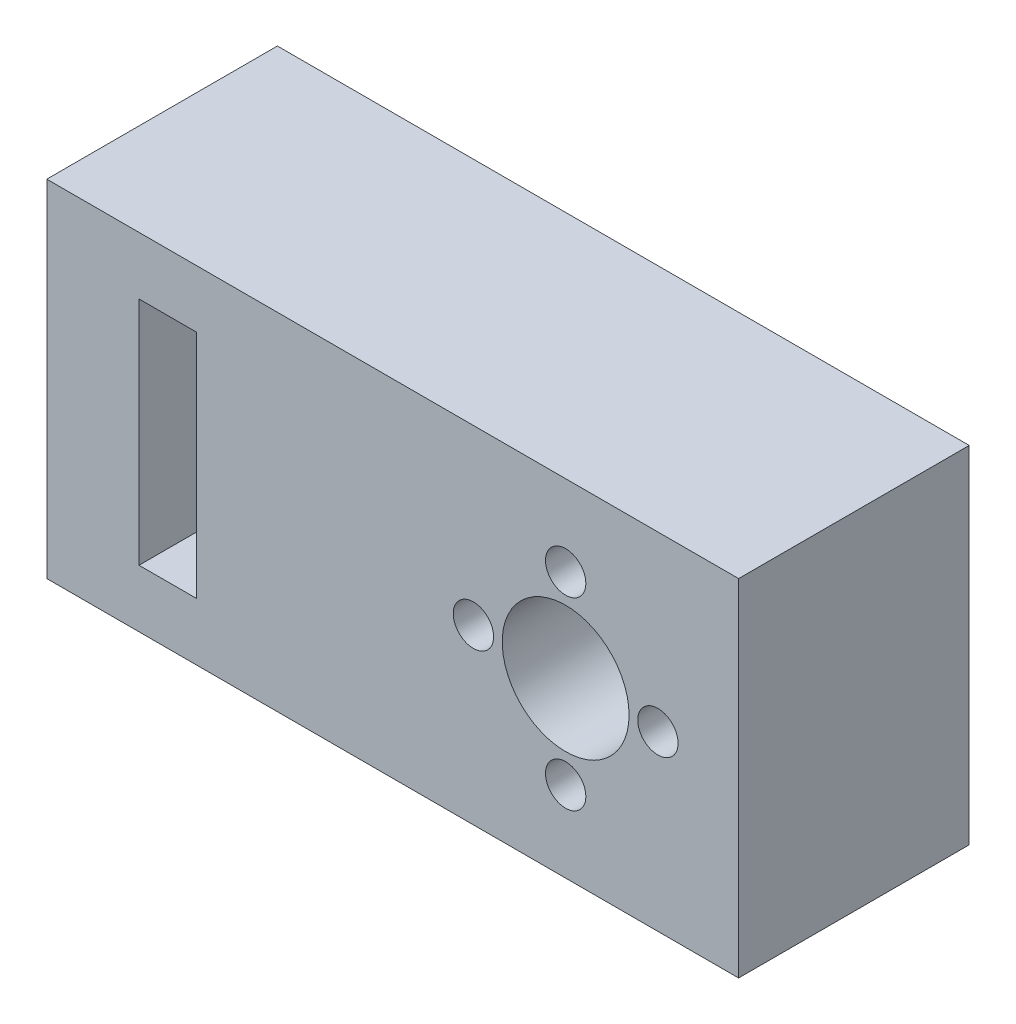
ISO-10303-21;
HEADER;
FILE_DESCRIPTION(('STEP AP214'),'2;1');
FILE_NAME('part.step','',(''),(''),'','','');
FILE_SCHEMA(('AUTOMOTIVE_DESIGN { 1 0 10303 214 1 1 1 1 }'));
ENDSEC;
DATA;
#1=APPLICATION_CONTEXT('core data for automotive mechanical design processes');
#2=APPLICATION_PROTOCOL_DEFINITION('international standard','automotive_design',2000,#1);
#3=PRODUCT_CONTEXT('',#1,'mechanical');
#4=PRODUCT('Part','Part','',(#3));
#5=PRODUCT_RELATED_PRODUCT_CATEGORY('part','',(#4));
#6=PRODUCT_DEFINITION_FORMATION('','',#4);
#7=PRODUCT_DEFINITION_CONTEXT('part definition',#1,'design');
#8=PRODUCT_DEFINITION('design','',#6,#7);
#9=PRODUCT_DEFINITION_SHAPE('','',#8);
#10=(LENGTH_UNIT() NAMED_UNIT(*) SI_UNIT(.MILLI.,.METRE.));
#11=(NAMED_UNIT(*) PLANE_ANGLE_UNIT() SI_UNIT($,.RADIAN.));
#12=(NAMED_UNIT(*) SI_UNIT($,.STERADIAN.) SOLID_ANGLE_UNIT());
#13=UNCERTAINTY_MEASURE_WITH_UNIT(LENGTH_MEASURE(1.E-05),#10,'distance_accuracy_value','');
#14=(GEOMETRIC_REPRESENTATION_CONTEXT(3) GLOBAL_UNCERTAINTY_ASSIGNED_CONTEXT((#13)) GLOBAL_UNIT_ASSIGNED_CONTEXT((#10,
#11,#12)) REPRESENTATION_CONTEXT('',''));
#15=CARTESIAN_POINT('',(0.,0.,0.));
#16=DIRECTION('',(0.,0.,1.));
#17=DIRECTION('',(1.,0.,0.));
#18=AXIS2_PLACEMENT_3D('',#15,#16,#17);
#19=CARTESIAN_POINT('',(0.,0.,10.));
#20=DIRECTION('',(0.,0.,1.));
#21=DIRECTION('',(1.,0.,0.));
#22=AXIS2_PLACEMENT_3D('',#19,#20,#21);
#23=PLANE('',#22);
#24=CARTESIAN_POINT('',(15.0000000000002,-8.,10.));
#25=DIRECTION('',(0.,0.,1.));
#26=DIRECTION('',(1.,0.,0.));
#27=AXIS2_PLACEMENT_3D('',#24,#25,#26);
#28=CIRCLE('',#27,1.75);
#29=CARTESIAN_POINT('',(16.7500000000002,-8.,10.));
#30=VERTEX_POINT('',#29);
#31=EDGE_CURVE('E272',#30,#30,#28,.T.);
#32=ORIENTED_EDGE('',*,*,#31,.F.);
#33=EDGE_LOOP('',(#32));
#34=FACE_BOUND('',#33,.T.);
#35=CARTESIAN_POINT('',(15.,8.,10.));
#36=DIRECTION('',(0.,0.,1.));
#37=DIRECTION('',(1.,0.,0.));
#38=AXIS2_PLACEMENT_3D('',#35,#36,#37);
#39=CIRCLE('',#38,1.75);
#40=CARTESIAN_POINT('',(16.75,8.,10.));
#41=VERTEX_POINT('',#40);
#42=EDGE_CURVE('E127',#41,#41,#39,.T.);
#43=ORIENTED_EDGE('',*,*,#42,.F.);
#44=EDGE_LOOP('',(#43));
#45=FACE_BOUND('',#44,.T.);
#46=CARTESIAN_POINT('',(15.,0.,10.));
#47=DIRECTION('',(0.,0.,1.));
#48=DIRECTION('',(1.,0.,0.));
#49=AXIS2_PLACEMENT_3D('',#46,#47,#48);
#50=CIRCLE('',#49,5.5);
#51=CARTESIAN_POINT('',(20.5,0.,10.));
#52=VERTEX_POINT('',#51);
#53=EDGE_CURVE('E137',#52,#52,#50,.T.);
#54=ORIENTED_EDGE('',*,*,#53,.F.);
#55=EDGE_LOOP('',(#54));
#56=FACE_BOUND('',#55,.T.);
#57=DIRECTION('',(0.,1.,0.));
#58=VECTOR('',#57,1.);
#59=CARTESIAN_POINT('',(30.,15.,10.));
#60=LINE('',#59,#58);
#61=CARTESIAN_POINT('',(30.,-15.,10.));
#62=VERTEX_POINT('',#61);
#63=CARTESIAN_POINT('',(30.,15.,10.));
#64=VERTEX_POINT('',#63);
#65=EDGE_CURVE('E143',#62,#64,#60,.T.);
#66=ORIENTED_EDGE('',*,*,#65,.T.);
#67=DIRECTION('',(-1.,0.,0.));
#68=VECTOR('',#67,1.);
#69=CARTESIAN_POINT('',(-30.,15.,10.));
#70=LINE('',#69,#68);
#71=CARTESIAN_POINT('',(-30.,15.,10.));
#72=VERTEX_POINT('',#71);
#73=EDGE_CURVE('E146',#64,#72,#70,.T.);
#74=ORIENTED_EDGE('',*,*,#73,.T.);
#75=DIRECTION('',(0.,-1.,0.));
#76=VECTOR('',#75,1.);
#77=CARTESIAN_POINT('',(-30.,15.,10.));
#78=LINE('',#77,#76);
#79=CARTESIAN_POINT('',(-30.,-15.,10.));
#80=VERTEX_POINT('',#79);
#81=EDGE_CURVE('E149',#72,#80,#78,.T.);
#82=ORIENTED_EDGE('',*,*,#81,.T.);
#83=DIRECTION('',(1.,0.,0.));
#84=VECTOR('',#83,1.);
#85=CARTESIAN_POINT('',(-30.,-15.,10.));
#86=LINE('',#85,#84);
#87=EDGE_CURVE('E151',#80,#62,#86,.T.);
#88=ORIENTED_EDGE('',*,*,#87,.T.);
#89=EDGE_LOOP('',(#66,#74,#82,#88));
#90=FACE_BOUND('',#89,.T.);
#91=DIRECTION('',(1.,0.,0.));
#92=VECTOR('',#91,1.);
#93=CARTESIAN_POINT('',(-22.,-9.99999999999999,10.));
#94=LINE('',#93,#92);
#95=CARTESIAN_POINT('',(-22.,-9.99999999999999,10.));
#96=VERTEX_POINT('',#95);
#97=CARTESIAN_POINT('',(-17.,-9.99999999999999,10.));
#98=VERTEX_POINT('',#97);
#99=EDGE_CURVE('E106',#96,#98,#94,.T.);
#100=ORIENTED_EDGE('',*,*,#99,.F.);
#101=DIRECTION('',(0.,-1.,0.));
#102=VECTOR('',#101,1.);
#103=CARTESIAN_POINT('',(-22.,10.,10.));
#104=LINE('',#103,#102);
#105=CARTESIAN_POINT('',(-22.,10.,10.));
#106=VERTEX_POINT('',#105);
#107=EDGE_CURVE('E98',#106,#96,#104,.T.);
#108=ORIENTED_EDGE('',*,*,#107,.F.);
#109=DIRECTION('',(-1.,0.,0.));
#110=VECTOR('',#109,1.);
#111=CARTESIAN_POINT('',(-22.,10.,10.));
#112=LINE('',#111,#110);
#113=CARTESIAN_POINT('',(-17.,10.,10.));
#114=VERTEX_POINT('',#113);
#115=EDGE_CURVE('E121',#114,#106,#112,.T.);
#116=ORIENTED_EDGE('',*,*,#115,.F.);
#117=DIRECTION('',(0.,1.,0.));
#118=VECTOR('',#117,1.);
#119=CARTESIAN_POINT('',(-17.,10.,10.));
#120=LINE('',#119,#118);
#121=EDGE_CURVE('E119',#98,#114,#120,.T.);
#122=ORIENTED_EDGE('',*,*,#121,.F.);
#123=EDGE_LOOP('',(#100,#108,#116,#122));
#124=FACE_BOUND('',#123,.T.);
#125=CARTESIAN_POINT('',(23.0000000000001,0.,10.));
#126=DIRECTION('',(0.,0.,1.));
#127=DIRECTION('',(1.,0.,0.));
#128=AXIS2_PLACEMENT_3D('',#125,#126,#127);
#129=CIRCLE('',#128,1.75);
#130=CARTESIAN_POINT('',(24.7500000000001,0.,10.));
#131=VERTEX_POINT('',#130);
#132=EDGE_CURVE('E278',#131,#131,#129,.T.);
#133=ORIENTED_EDGE('',*,*,#132,.F.);
#134=EDGE_LOOP('',(#133));
#135=FACE_BOUND('',#134,.T.);
#136=CARTESIAN_POINT('',(7.00000000000012,0.,10.));
#137=DIRECTION('',(0.,0.,1.));
#138=DIRECTION('',(1.,0.,0.));
#139=AXIS2_PLACEMENT_3D('',#136,#137,#138);
#140=CIRCLE('',#139,1.75);
#141=CARTESIAN_POINT('',(8.75000000000012,0.,10.));
#142=VERTEX_POINT('',#141);
#143=EDGE_CURVE('E265',#142,#142,#140,.T.);
#144=ORIENTED_EDGE('',*,*,#143,.F.);
#145=EDGE_LOOP('',(#144));
#146=FACE_BOUND('',#145,.T.);
#147=ADVANCED_FACE('F33',(#34,#45,#56,#90,#124,#135,#146),#23,.T.);
#148=CARTESIAN_POINT('',(0.,0.,-10.));
#149=DIRECTION('',(0.,0.,1.));
#150=DIRECTION('',(1.,0.,0.));
#151=AXIS2_PLACEMENT_3D('',#148,#149,#150);
#152=PLANE('',#151);
#153=CARTESIAN_POINT('',(15.0000000000002,-8.,-10.));
#154=DIRECTION('',(0.,0.,1.));
#155=DIRECTION('',(1.,0.,0.));
#156=AXIS2_PLACEMENT_3D('',#153,#154,#155);
#157=CIRCLE('',#156,1.75);
#158=CARTESIAN_POINT('',(16.7500000000002,-8.,-10.));
#159=VERTEX_POINT('',#158);
#160=EDGE_CURVE('E270',#159,#159,#157,.T.);
#161=ORIENTED_EDGE('',*,*,#160,.T.);
#162=EDGE_LOOP('',(#161));
#163=FACE_BOUND('',#162,.T.);
#164=CARTESIAN_POINT('',(15.,8.,-10.));
#165=DIRECTION('',(0.,0.,1.));
#166=DIRECTION('',(1.,0.,0.));
#167=AXIS2_PLACEMENT_3D('',#164,#165,#166);
#168=CIRCLE('',#167,1.75);
#169=CARTESIAN_POINT('',(16.75,8.,-10.));
#170=VERTEX_POINT('',#169);
#171=EDGE_CURVE('E281',#170,#170,#168,.T.);
#172=ORIENTED_EDGE('',*,*,#171,.T.);
#173=EDGE_LOOP('',(#172));
#174=FACE_BOUND('',#173,.T.);
#175=CARTESIAN_POINT('',(15.,0.,-10.));
#176=DIRECTION('',(0.,0.,1.));
#177=DIRECTION('',(1.,0.,0.));
#178=AXIS2_PLACEMENT_3D('',#175,#176,#177);
#179=CIRCLE('',#178,5.5);
#180=CARTESIAN_POINT('',(20.5,0.,-10.));
#181=VERTEX_POINT('',#180);
#182=EDGE_CURVE('E114',#181,#181,#179,.T.);
#183=ORIENTED_EDGE('',*,*,#182,.T.);
#184=EDGE_LOOP('',(#183));
#185=FACE_BOUND('',#184,.T.);
#186=DIRECTION('',(0.,1.,0.));
#187=VECTOR('',#186,1.);
#188=CARTESIAN_POINT('',(30.,15.,-10.));
#189=LINE('',#188,#187);
#190=CARTESIAN_POINT('',(30.,-15.,-10.));
#191=VERTEX_POINT('',#190);
#192=CARTESIAN_POINT('',(30.,15.,-10.));
#193=VERTEX_POINT('',#192);
#194=EDGE_CURVE('E140',#191,#193,#189,.T.);
#195=ORIENTED_EDGE('',*,*,#194,.F.);
#196=DIRECTION('',(1.,0.,0.));
#197=VECTOR('',#196,1.);
#198=CARTESIAN_POINT('',(-30.,-15.,-10.));
#199=LINE('',#198,#197);
#200=CARTESIAN_POINT('',(-30.,-15.,-10.));
#201=VERTEX_POINT('',#200);
#202=EDGE_CURVE('E147',#201,#191,#199,.T.);
#203=ORIENTED_EDGE('',*,*,#202,.F.);
#204=DIRECTION('',(0.,-1.,0.));
#205=VECTOR('',#204,1.);
#206=CARTESIAN_POINT('',(-30.,15.,-10.));
#207=LINE('',#206,#205);
#208=CARTESIAN_POINT('',(-30.,15.,-10.));
#209=VERTEX_POINT('',#208);
#210=EDGE_CURVE('E158',#209,#201,#207,.T.);
#211=ORIENTED_EDGE('',*,*,#210,.F.);
#212=DIRECTION('',(-1.,0.,0.));
#213=VECTOR('',#212,1.);
#214=CARTESIAN_POINT('',(-30.,15.,-10.));
#215=LINE('',#214,#213);
#216=EDGE_CURVE('E156',#193,#209,#215,.T.);
#217=ORIENTED_EDGE('',*,*,#216,.F.);
#218=EDGE_LOOP('',(#195,#203,#211,#217));
#219=FACE_BOUND('',#218,.T.);
#220=DIRECTION('',(0.,-1.,0.));
#221=VECTOR('',#220,1.);
#222=CARTESIAN_POINT('',(-22.,10.,-10.));
#223=LINE('',#222,#221);
#224=CARTESIAN_POINT('',(-22.,10.,-10.));
#225=VERTEX_POINT('',#224);
#226=CARTESIAN_POINT('',(-22.,-9.99999999999999,-10.));
#227=VERTEX_POINT('',#226);
#228=EDGE_CURVE('E56',#225,#227,#223,.T.);
#229=ORIENTED_EDGE('',*,*,#228,.T.);
#230=DIRECTION('',(1.,0.,0.));
#231=VECTOR('',#230,1.);
#232=CARTESIAN_POINT('',(-22.,-9.99999999999999,-10.));
#233=LINE('',#232,#231);
#234=CARTESIAN_POINT('',(-17.,-9.99999999999999,-10.));
#235=VERTEX_POINT('',#234);
#236=EDGE_CURVE('E113',#227,#235,#233,.T.);
#237=ORIENTED_EDGE('',*,*,#236,.T.);
#238=DIRECTION('',(0.,1.,0.));
#239=VECTOR('',#238,1.);
#240=CARTESIAN_POINT('',(-17.,10.,-10.));
#241=LINE('',#240,#239);
#242=CARTESIAN_POINT('',(-17.,10.,-10.));
#243=VERTEX_POINT('',#242);
#244=EDGE_CURVE('E129',#235,#243,#241,.T.);
#245=ORIENTED_EDGE('',*,*,#244,.T.);
#246=DIRECTION('',(-1.,0.,0.));
#247=VECTOR('',#246,1.);
#248=CARTESIAN_POINT('',(-22.,10.,-10.));
#249=LINE('',#248,#247);
#250=EDGE_CURVE('E107',#243,#225,#249,.T.);
#251=ORIENTED_EDGE('',*,*,#250,.T.);
#252=EDGE_LOOP('',(#229,#237,#245,#251));
#253=FACE_BOUND('',#252,.T.);
#254=CARTESIAN_POINT('',(23.0000000000001,0.,-10.));
#255=DIRECTION('',(0.,0.,1.));
#256=DIRECTION('',(1.,0.,0.));
#257=AXIS2_PLACEMENT_3D('',#254,#255,#256);
#258=CIRCLE('',#257,1.75);
#259=CARTESIAN_POINT('',(24.7500000000001,0.,-10.));
#260=VERTEX_POINT('',#259);
#261=EDGE_CURVE('E275',#260,#260,#258,.T.);
#262=ORIENTED_EDGE('',*,*,#261,.T.);
#263=EDGE_LOOP('',(#262));
#264=FACE_BOUND('',#263,.T.);
#265=CARTESIAN_POINT('',(7.00000000000012,0.,-10.));
#266=DIRECTION('',(0.,0.,1.));
#267=DIRECTION('',(1.,0.,0.));
#268=AXIS2_PLACEMENT_3D('',#265,#266,#267);
#269=CIRCLE('',#268,1.75);
#270=CARTESIAN_POINT('',(8.75000000000012,0.,-10.));
#271=VERTEX_POINT('',#270);
#272=EDGE_CURVE('E262',#271,#271,#269,.T.);
#273=ORIENTED_EDGE('',*,*,#272,.T.);
#274=EDGE_LOOP('',(#273));
#275=FACE_BOUND('',#274,.T.);
#276=ADVANCED_FACE('F176',(#163,#174,#185,#219,#253,#264,#275),#152,.F.);
#277=CARTESIAN_POINT('',(30.,15.,10.));
#278=DIRECTION('',(-1.,0.,0.));
#279=DIRECTION('',(0.,-1.,0.));
#280=AXIS2_PLACEMENT_3D('',#277,#278,#279);
#281=PLANE('',#280);
#282=ORIENTED_EDGE('',*,*,#194,.T.);
#283=DIRECTION('',(0.,0.,-1.));
#284=VECTOR('',#283,1.);
#285=CARTESIAN_POINT('',(30.,15.,10.));
#286=LINE('',#285,#284);
#287=EDGE_CURVE('E11',#64,#193,#286,.T.);
#288=ORIENTED_EDGE('',*,*,#287,.F.);
#289=ORIENTED_EDGE('',*,*,#65,.F.);
#290=DIRECTION('',(0.,0.,-1.));
#291=VECTOR('',#290,1.);
#292=CARTESIAN_POINT('',(30.,-15.,10.));
#293=LINE('',#292,#291);
#294=EDGE_CURVE('E153',#62,#191,#293,.T.);
#295=ORIENTED_EDGE('',*,*,#294,.T.);
#296=EDGE_LOOP('',(#282,#288,#289,#295));
#297=FACE_BOUND('',#296,.T.);
#298=ADVANCED_FACE('F35',(#297),#281,.F.);
#299=CARTESIAN_POINT('',(-30.,15.,10.));
#300=DIRECTION('',(0.,-1.,0.));
#301=DIRECTION('',(0.,0.,-1.));
#302=AXIS2_PLACEMENT_3D('',#299,#300,#301);
#303=PLANE('',#302);
#304=ORIENTED_EDGE('',*,*,#216,.T.);
#305=DIRECTION('',(0.,0.,-1.));
#306=VECTOR('',#305,1.);
#307=CARTESIAN_POINT('',(-30.,15.,10.));
#308=LINE('',#307,#306);
#309=EDGE_CURVE('E41',#72,#209,#308,.T.);
#310=ORIENTED_EDGE('',*,*,#309,.F.);
#311=ORIENTED_EDGE('',*,*,#73,.F.);
#312=ORIENTED_EDGE('',*,*,#287,.T.);
#313=EDGE_LOOP('',(#304,#310,#311,#312));
#314=FACE_BOUND('',#313,.T.);
#315=ADVANCED_FACE('F186',(#314),#303,.F.);
#316=CARTESIAN_POINT('',(-30.,15.,10.));
#317=DIRECTION('',(1.,0.,0.));
#318=DIRECTION('',(0.,1.,0.));
#319=AXIS2_PLACEMENT_3D('',#316,#317,#318);
#320=PLANE('',#319);
#321=CARTESIAN_POINT('',(-30.,0.,0.));
#322=DIRECTION('',(-1.,0.,0.));
#323=DIRECTION('',(0.,-1.,0.));
#324=AXIS2_PLACEMENT_3D('',#321,#322,#323);
#325=CIRCLE('',#324,2.5);
#326=CARTESIAN_POINT('',(-30.,-2.5,0.));
#327=VERTEX_POINT('',#326);
#328=EDGE_CURVE('E259',#327,#327,#325,.T.);
#329=ORIENTED_EDGE('',*,*,#328,.F.);
#330=EDGE_LOOP('',(#329));
#331=FACE_BOUND('',#330,.T.);
#332=ORIENTED_EDGE('',*,*,#210,.T.);
#333=DIRECTION('',(0.,0.,-1.));
#334=VECTOR('',#333,1.);
#335=CARTESIAN_POINT('',(-30.,-15.,10.));
#336=LINE('',#335,#334);
#337=EDGE_CURVE('E163',#80,#201,#336,.T.);
#338=ORIENTED_EDGE('',*,*,#337,.F.);
#339=ORIENTED_EDGE('',*,*,#81,.F.);
#340=ORIENTED_EDGE('',*,*,#309,.T.);
#341=EDGE_LOOP('',(#332,#338,#339,#340));
#342=FACE_BOUND('',#341,.T.);
#343=ADVANCED_FACE('F170',(#331,#342),#320,.F.);
#344=CARTESIAN_POINT('',(-30.,-15.,10.));
#345=DIRECTION('',(0.,1.,0.));
#346=DIRECTION('',(0.,0.,1.));
#347=AXIS2_PLACEMENT_3D('',#344,#345,#346);
#348=PLANE('',#347);
#349=ORIENTED_EDGE('',*,*,#202,.T.);
#350=ORIENTED_EDGE('',*,*,#294,.F.);
#351=ORIENTED_EDGE('',*,*,#87,.F.);
#352=ORIENTED_EDGE('',*,*,#337,.T.);
#353=EDGE_LOOP('',(#349,#350,#351,#352));
#354=FACE_BOUND('',#353,.T.);
#355=ADVANCED_FACE('F180',(#354),#348,.F.);
#356=CARTESIAN_POINT('',(15.,0.,10.));
#357=DIRECTION('',(0.,0.,-1.));
#358=DIRECTION('',(-1.,0.,0.));
#359=AXIS2_PLACEMENT_3D('',#356,#357,#358);
#360=CYLINDRICAL_SURFACE('',#359,5.5);
#361=ORIENTED_EDGE('',*,*,#53,.T.);
#362=EDGE_LOOP('',(#361));
#363=FACE_BOUND('',#362,.T.);
#364=ORIENTED_EDGE('',*,*,#182,.F.);
#365=EDGE_LOOP('',(#364));
#366=FACE_BOUND('',#365,.T.);
#367=ADVANCED_FACE('F205',(#363,#366),#360,.F.);
#368=CARTESIAN_POINT('',(-22.,10.,10.));
#369=DIRECTION('',(1.,0.,0.));
#370=DIRECTION('',(0.,1.,0.));
#371=AXIS2_PLACEMENT_3D('',#368,#369,#370);
#372=PLANE('',#371);
#373=CARTESIAN_POINT('',(-22.,0.,0.));
#374=DIRECTION('',(1.,0.,0.));
#375=DIRECTION('',(0.,1.,0.));
#376=AXIS2_PLACEMENT_3D('',#373,#374,#375);
#377=CIRCLE('',#376,2.5);
#378=CARTESIAN_POINT('',(-22.,2.5,0.));
#379=VERTEX_POINT('',#378);
#380=EDGE_CURVE('E261',#379,#379,#377,.F.);
#381=ORIENTED_EDGE('',*,*,#380,.T.);
#382=EDGE_LOOP('',(#381));
#383=FACE_BOUND('',#382,.T.);
#384=ORIENTED_EDGE('',*,*,#228,.F.);
#385=DIRECTION('',(0.,0.,-1.));
#386=VECTOR('',#385,1.);
#387=CARTESIAN_POINT('',(-22.,10.,10.));
#388=LINE('',#387,#386);
#389=EDGE_CURVE('E102',#106,#225,#388,.T.);
#390=ORIENTED_EDGE('',*,*,#389,.F.);
#391=ORIENTED_EDGE('',*,*,#107,.T.);
#392=DIRECTION('',(0.,0.,-1.));
#393=VECTOR('',#392,1.);
#394=CARTESIAN_POINT('',(-22.,-9.99999999999999,10.));
#395=LINE('',#394,#393);
#396=EDGE_CURVE('E101',#96,#227,#395,.T.);
#397=ORIENTED_EDGE('',*,*,#396,.T.);
#398=EDGE_LOOP('',(#384,#390,#391,#397));
#399=FACE_BOUND('',#398,.T.);
#400=ADVANCED_FACE('F100',(#383,#399),#372,.T.);
#401=CARTESIAN_POINT('',(-22.,-9.99999999999999,10.));
#402=DIRECTION('',(0.,1.,0.));
#403=DIRECTION('',(0.,0.,1.));
#404=AXIS2_PLACEMENT_3D('',#401,#402,#403);
#405=PLANE('',#404);
#406=ORIENTED_EDGE('',*,*,#236,.F.);
#407=ORIENTED_EDGE('',*,*,#396,.F.);
#408=ORIENTED_EDGE('',*,*,#99,.T.);
#409=DIRECTION('',(0.,0.,-1.));
#410=VECTOR('',#409,1.);
#411=CARTESIAN_POINT('',(-17.,-9.99999999999999,10.));
#412=LINE('',#411,#410);
#413=EDGE_CURVE('E115',#98,#235,#412,.T.);
#414=ORIENTED_EDGE('',*,*,#413,.T.);
#415=EDGE_LOOP('',(#406,#407,#408,#414));
#416=FACE_BOUND('',#415,.T.);
#417=ADVANCED_FACE('F110',(#416),#405,.T.);
#418=CARTESIAN_POINT('',(-17.,10.,10.));
#419=DIRECTION('',(-1.,0.,0.));
#420=DIRECTION('',(0.,-1.,0.));
#421=AXIS2_PLACEMENT_3D('',#418,#419,#420);
#422=PLANE('',#421);
#423=ORIENTED_EDGE('',*,*,#244,.F.);
#424=ORIENTED_EDGE('',*,*,#413,.F.);
#425=ORIENTED_EDGE('',*,*,#121,.T.);
#426=DIRECTION('',(0.,0.,-1.));
#427=VECTOR('',#426,1.);
#428=CARTESIAN_POINT('',(-17.,10.,10.));
#429=LINE('',#428,#427);
#430=EDGE_CURVE('E48',#114,#243,#429,.T.);
#431=ORIENTED_EDGE('',*,*,#430,.T.);
#432=EDGE_LOOP('',(#423,#424,#425,#431));
#433=FACE_BOUND('',#432,.T.);
#434=ADVANCED_FACE('F225',(#433),#422,.T.);
#435=CARTESIAN_POINT('',(-22.,10.,10.));
#436=DIRECTION('',(0.,-1.,0.));
#437=DIRECTION('',(0.,0.,-1.));
#438=AXIS2_PLACEMENT_3D('',#435,#436,#437);
#439=PLANE('',#438);
#440=ORIENTED_EDGE('',*,*,#250,.F.);
#441=ORIENTED_EDGE('',*,*,#430,.F.);
#442=ORIENTED_EDGE('',*,*,#115,.T.);
#443=ORIENTED_EDGE('',*,*,#389,.T.);
#444=EDGE_LOOP('',(#440,#441,#442,#443));
#445=FACE_BOUND('',#444,.T.);
#446=ADVANCED_FACE('F231',(#445),#439,.T.);
#447=CARTESIAN_POINT('',(15.,8.,10.));
#448=DIRECTION('',(0.,0.,-1.));
#449=DIRECTION('',(-1.,0.,0.));
#450=AXIS2_PLACEMENT_3D('',#447,#448,#449);
#451=CYLINDRICAL_SURFACE('',#450,1.75);
#452=ORIENTED_EDGE('',*,*,#42,.T.);
#453=EDGE_LOOP('',(#452));
#454=FACE_BOUND('',#453,.T.);
#455=ORIENTED_EDGE('',*,*,#171,.F.);
#456=EDGE_LOOP('',(#455));
#457=FACE_BOUND('',#456,.T.);
#458=ADVANCED_FACE('F235',(#454,#457),#451,.F.);
#459=CARTESIAN_POINT('',(23.0000000000001,0.,10.));
#460=DIRECTION('',(0.,0.,-1.));
#461=DIRECTION('',(-1.,0.,0.));
#462=AXIS2_PLACEMENT_3D('',#459,#460,#461);
#463=CYLINDRICAL_SURFACE('',#462,1.75);
#464=ORIENTED_EDGE('',*,*,#132,.T.);
#465=EDGE_LOOP('',(#464));
#466=FACE_BOUND('',#465,.T.);
#467=ORIENTED_EDGE('',*,*,#261,.F.);
#468=EDGE_LOOP('',(#467));
#469=FACE_BOUND('',#468,.T.);
#470=ADVANCED_FACE('F238',(#466,#469),#463,.F.);
#471=CARTESIAN_POINT('',(15.0000000000002,-8.,10.));
#472=DIRECTION('',(0.,0.,-1.));
#473=DIRECTION('',(-1.,0.,0.));
#474=AXIS2_PLACEMENT_3D('',#471,#472,#473);
#475=CYLINDRICAL_SURFACE('',#474,1.75);
#476=ORIENTED_EDGE('',*,*,#31,.T.);
#477=EDGE_LOOP('',(#476));
#478=FACE_BOUND('',#477,.T.);
#479=ORIENTED_EDGE('',*,*,#160,.F.);
#480=EDGE_LOOP('',(#479));
#481=FACE_BOUND('',#480,.T.);
#482=ADVANCED_FACE('F242',(#478,#481),#475,.F.);
#483=CARTESIAN_POINT('',(7.00000000000012,0.,10.));
#484=DIRECTION('',(0.,0.,-1.));
#485=DIRECTION('',(-1.,0.,0.));
#486=AXIS2_PLACEMENT_3D('',#483,#484,#485);
#487=CYLINDRICAL_SURFACE('',#486,1.75);
#488=ORIENTED_EDGE('',*,*,#143,.T.);
#489=EDGE_LOOP('',(#488));
#490=FACE_BOUND('',#489,.T.);
#491=ORIENTED_EDGE('',*,*,#272,.F.);
#492=EDGE_LOOP('',(#491));
#493=FACE_BOUND('',#492,.T.);
#494=ADVANCED_FACE('F246',(#490,#493),#487,.F.);
#495=CARTESIAN_POINT('',(-14.9289321881345,0.,0.));
#496=DIRECTION('',(-1.,0.,0.));
#497=DIRECTION('',(0.,-1.,0.));
#498=AXIS2_PLACEMENT_3D('',#495,#496,#497);
#499=CYLINDRICAL_SURFACE('',#498,2.5);
#500=ORIENTED_EDGE('',*,*,#328,.T.);
#501=EDGE_LOOP('',(#500));
#502=FACE_BOUND('',#501,.T.);
#503=ORIENTED_EDGE('',*,*,#380,.F.);
#504=EDGE_LOOP('',(#503));
#505=FACE_BOUND('',#504,.T.);
#506=ADVANCED_FACE('F250',(#502,#505),#499,.F.);
#507=CLOSED_SHELL('',(#147,#276,#298,#315,#343,#355,#367,#400,#417,#434,#446,#458,#470,#482,
#494,#506));
#508=MANIFOLD_SOLID_BREP('B2',#507);
#509=ADVANCED_BREP_SHAPE_REPRESENTATION('',(#18,#508),#14);
#510=SHAPE_DEFINITION_REPRESENTATION(#9,#509);
ENDSEC;
END-ISO-10303-21;
